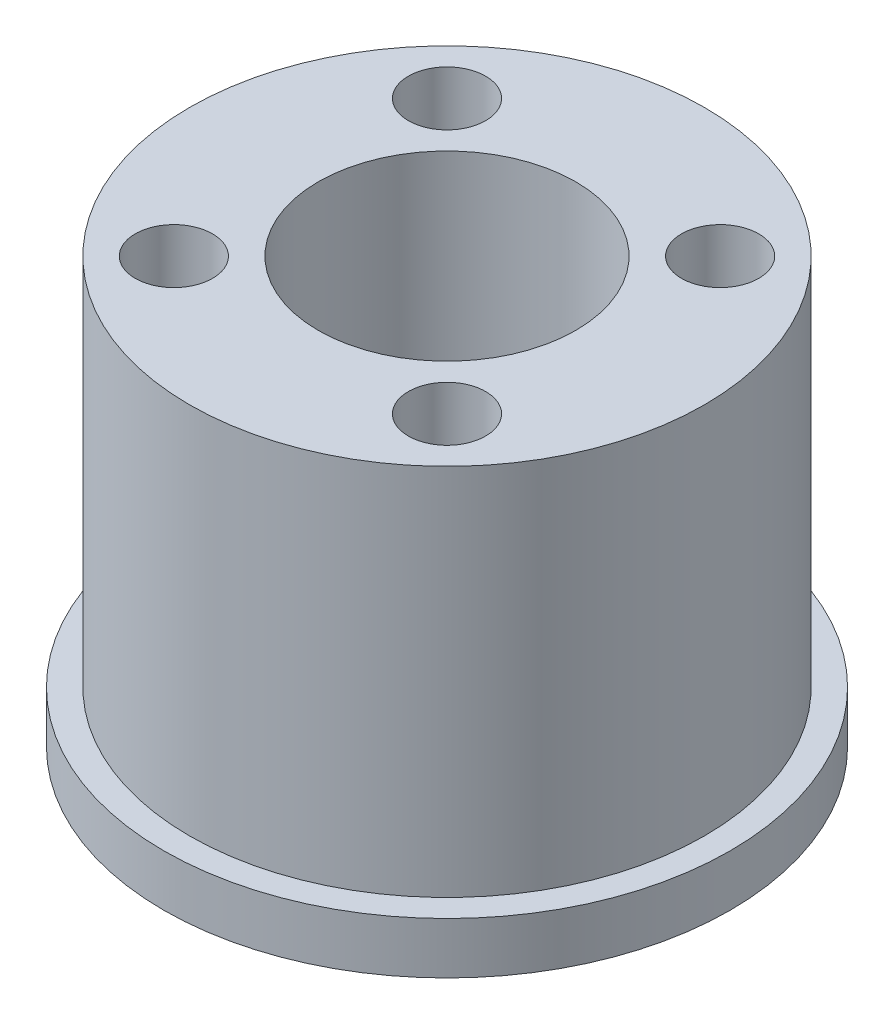
ISO-10303-21;
HEADER;
FILE_DESCRIPTION(('STEP AP214'),'2;1');
FILE_NAME('part.step','',(''),(''),'','','');
FILE_SCHEMA(('AUTOMOTIVE_DESIGN { 1 0 10303 214 1 1 1 1 }'));
ENDSEC;
DATA;
#1=APPLICATION_CONTEXT('core data for automotive mechanical design processes');
#2=APPLICATION_PROTOCOL_DEFINITION('international standard','automotive_design',2000,#1);
#3=PRODUCT_CONTEXT('',#1,'mechanical');
#4=PRODUCT('Part','Part','',(#3));
#5=PRODUCT_RELATED_PRODUCT_CATEGORY('part','',(#4));
#6=PRODUCT_DEFINITION_FORMATION('','',#4);
#7=PRODUCT_DEFINITION_CONTEXT('part definition',#1,'design');
#8=PRODUCT_DEFINITION('design','',#6,#7);
#9=PRODUCT_DEFINITION_SHAPE('','',#8);
#10=(LENGTH_UNIT() NAMED_UNIT(*) SI_UNIT(.MILLI.,.METRE.));
#11=(NAMED_UNIT(*) PLANE_ANGLE_UNIT() SI_UNIT($,.RADIAN.));
#12=(NAMED_UNIT(*) SI_UNIT($,.STERADIAN.) SOLID_ANGLE_UNIT());
#13=UNCERTAINTY_MEASURE_WITH_UNIT(LENGTH_MEASURE(1.E-05),#10,'distance_accuracy_value','');
#14=(GEOMETRIC_REPRESENTATION_CONTEXT(3) GLOBAL_UNCERTAINTY_ASSIGNED_CONTEXT((#13)) GLOBAL_UNIT_ASSIGNED_CONTEXT((#10,
#11,#12)) REPRESENTATION_CONTEXT('',''));
#15=CARTESIAN_POINT('',(0.,0.,0.));
#16=DIRECTION('',(0.,0.,1.));
#17=DIRECTION('',(1.,0.,0.));
#18=AXIS2_PLACEMENT_3D('',#15,#16,#17);
#19=CARTESIAN_POINT('',(0.,2.,0.));
#20=DIRECTION('',(0.,-1.,0.));
#21=DIRECTION('',(0.,0.,-1.));
#22=AXIS2_PLACEMENT_3D('',#19,#20,#21);
#23=CYLINDRICAL_SURFACE('',#22,11.);
#24=CARTESIAN_POINT('',(0.,2.,0.));
#25=DIRECTION('',(0.,-1.,0.));
#26=DIRECTION('',(0.,0.,-1.));
#27=AXIS2_PLACEMENT_3D('',#24,#25,#26);
#28=CIRCLE('',#27,11.);
#29=CARTESIAN_POINT('',(0.,2.,-11.));
#30=VERTEX_POINT('',#29);
#31=EDGE_CURVE('E35',#30,#30,#28,.T.);
#32=ORIENTED_EDGE('',*,*,#31,.T.);
#33=EDGE_LOOP('',(#32));
#34=FACE_BOUND('',#33,.T.);
#35=CARTESIAN_POINT('',(0.,0.,0.));
#36=DIRECTION('',(0.,-1.,0.));
#37=DIRECTION('',(0.,0.,-1.));
#38=AXIS2_PLACEMENT_3D('',#35,#36,#37);
#39=CIRCLE('',#38,11.);
#40=CARTESIAN_POINT('',(0.,0.,-11.));
#41=VERTEX_POINT('',#40);
#42=EDGE_CURVE('E43',#41,#41,#39,.T.);
#43=ORIENTED_EDGE('',*,*,#42,.F.);
#44=EDGE_LOOP('',(#43));
#45=FACE_BOUND('',#44,.T.);
#46=ADVANCED_FACE('F32',(#34,#45),#23,.T.);
#47=CARTESIAN_POINT('',(11.,2.,0.));
#48=DIRECTION('',(0.,1.,0.));
#49=DIRECTION('',(0.,0.,1.));
#50=AXIS2_PLACEMENT_3D('',#47,#48,#49);
#51=PLANE('',#50);
#52=CARTESIAN_POINT('',(0.,2.,0.));
#53=DIRECTION('',(0.,1.,0.));
#54=DIRECTION('',(0.,0.,1.));
#55=AXIS2_PLACEMENT_3D('',#52,#53,#54);
#56=CIRCLE('',#55,10.);
#57=CARTESIAN_POINT('',(0.,2.,-10.));
#58=VERTEX_POINT('',#57);
#59=EDGE_CURVE('E10',#58,#58,#56,.T.);
#60=ORIENTED_EDGE('',*,*,#59,.F.);
#61=EDGE_LOOP('',(#60));
#62=FACE_BOUND('',#61,.T.);
#63=ORIENTED_EDGE('',*,*,#31,.F.);
#64=EDGE_LOOP('',(#63));
#65=FACE_BOUND('',#64,.T.);
#66=ADVANCED_FACE('F91',(#62,#65),#51,.T.);
#67=CARTESIAN_POINT('',(0.,0.,0.));
#68=DIRECTION('',(0.,-1.,0.));
#69=DIRECTION('',(0.,0.,-1.));
#70=AXIS2_PLACEMENT_3D('',#67,#68,#69);
#71=PLANE('',#70);
#72=CARTESIAN_POINT('',(0.,0.,0.));
#73=DIRECTION('',(0.,-1.,0.));
#74=DIRECTION('',(0.,0.,-1.));
#75=AXIS2_PLACEMENT_3D('',#72,#73,#74);
#76=CIRCLE('',#75,4.99999999999999);
#77=CARTESIAN_POINT('',(0.,0.,-4.99999999999999));
#78=VERTEX_POINT('',#77);
#79=EDGE_CURVE('E82',#78,#78,#76,.T.);
#80=ORIENTED_EDGE('',*,*,#79,.F.);
#81=EDGE_LOOP('',(#80));
#82=FACE_BOUND('',#81,.T.);
#83=ORIENTED_EDGE('',*,*,#42,.T.);
#84=EDGE_LOOP('',(#83));
#85=FACE_BOUND('',#84,.T.);
#86=ADVANCED_FACE('F88',(#82,#85),#71,.T.);
#87=CARTESIAN_POINT('',(0.,16.5,0.));
#88=DIRECTION('',(0.,-1.,0.));
#89=DIRECTION('',(0.,0.,-1.));
#90=AXIS2_PLACEMENT_3D('',#87,#88,#89);
#91=CYLINDRICAL_SURFACE('',#90,10.);
#92=CARTESIAN_POINT('',(0.,16.5,0.));
#93=DIRECTION('',(0.,1.,0.));
#94=DIRECTION('',(0.,0.,1.));
#95=AXIS2_PLACEMENT_3D('',#92,#93,#94);
#96=CIRCLE('',#95,10.);
#97=CARTESIAN_POINT('',(0.,16.5,-10.));
#98=VERTEX_POINT('',#97);
#99=EDGE_CURVE('E45',#98,#98,#96,.T.);
#100=CARTESIAN_POINT('',(0.,16.5,-10.));
#101=CARTESIAN_POINT('',(0.,16.3489583333333,-10.));
#102=CARTESIAN_POINT('',(0.,16.1979166666667,-10.));
#103=CARTESIAN_POINT('',(0.,15.8958333333333,-10.));
#104=CARTESIAN_POINT('',(0.,15.7447916666667,-10.));
#105=CARTESIAN_POINT('',(0.,15.4427083333333,-10.));
#106=CARTESIAN_POINT('',(0.,15.2916666666667,-10.));
#107=CARTESIAN_POINT('',(0.,14.9895833333333,-10.));
#108=CARTESIAN_POINT('',(0.,14.8385416666667,-10.));
#109=CARTESIAN_POINT('',(0.,14.5364583333333,-10.));
#110=CARTESIAN_POINT('',(0.,14.3854166666667,-10.));
#111=CARTESIAN_POINT('',(0.,14.0833333333333,-10.));
#112=CARTESIAN_POINT('',(0.,13.9322916666667,-10.));
#113=CARTESIAN_POINT('',(0.,13.6302083333333,-10.));
#114=CARTESIAN_POINT('',(0.,13.4791666666667,-10.));
#115=CARTESIAN_POINT('',(0.,13.1770833333333,-10.));
#116=CARTESIAN_POINT('',(0.,13.0260416666667,-10.));
#117=CARTESIAN_POINT('',(0.,12.7239583333333,-10.));
#118=CARTESIAN_POINT('',(0.,12.5729166666667,-10.));
#119=CARTESIAN_POINT('',(0.,12.2708333333333,-10.));
#120=CARTESIAN_POINT('',(0.,12.1197916666667,-10.));
#121=CARTESIAN_POINT('',(0.,11.8177083333333,-10.));
#122=CARTESIAN_POINT('',(0.,11.6666666666667,-10.));
#123=CARTESIAN_POINT('',(0.,11.3645833333333,-10.));
#124=CARTESIAN_POINT('',(0.,11.2135416666667,-10.));
#125=CARTESIAN_POINT('',(0.,10.9114583333333,-10.));
#126=CARTESIAN_POINT('',(0.,10.7604166666667,-10.));
#127=CARTESIAN_POINT('',(0.,10.4583333333333,-10.));
#128=CARTESIAN_POINT('',(0.,10.3072916666667,-10.));
#129=CARTESIAN_POINT('',(0.,10.0052083333333,-10.));
#130=CARTESIAN_POINT('',(0.,9.85416666666667,-10.));
#131=CARTESIAN_POINT('',(0.,9.55208333333333,-10.));
#132=CARTESIAN_POINT('',(0.,9.40104166666667,-10.));
#133=CARTESIAN_POINT('',(0.,9.09895833333333,-10.));
#134=CARTESIAN_POINT('',(0.,8.94791666666667,-10.));
#135=CARTESIAN_POINT('',(0.,8.64583333333333,-10.));
#136=CARTESIAN_POINT('',(0.,8.49479166666667,-10.));
#137=CARTESIAN_POINT('',(0.,8.19270833333333,-10.));
#138=CARTESIAN_POINT('',(0.,8.04166666666667,-10.));
#139=CARTESIAN_POINT('',(0.,7.73958333333333,-10.));
#140=CARTESIAN_POINT('',(0.,7.58854166666667,-10.));
#141=CARTESIAN_POINT('',(0.,7.28645833333333,-10.));
#142=CARTESIAN_POINT('',(0.,7.13541666666667,-10.));
#143=CARTESIAN_POINT('',(0.,6.83333333333333,-10.));
#144=CARTESIAN_POINT('',(0.,6.68229166666667,-10.));
#145=CARTESIAN_POINT('',(0.,6.38020833333333,-10.));
#146=CARTESIAN_POINT('',(0.,6.22916666666667,-10.));
#147=CARTESIAN_POINT('',(0.,5.92708333333333,-10.));
#148=CARTESIAN_POINT('',(0.,5.77604166666667,-10.));
#149=CARTESIAN_POINT('',(0.,5.47395833333333,-10.));
#150=CARTESIAN_POINT('',(0.,5.32291666666667,-10.));
#151=CARTESIAN_POINT('',(0.,5.02083333333333,-10.));
#152=CARTESIAN_POINT('',(0.,4.86979166666667,-10.));
#153=CARTESIAN_POINT('',(0.,4.56770833333333,-10.));
#154=CARTESIAN_POINT('',(0.,4.41666666666667,-10.));
#155=CARTESIAN_POINT('',(0.,4.11458333333333,-10.));
#156=CARTESIAN_POINT('',(0.,3.96354166666667,-10.));
#157=CARTESIAN_POINT('',(0.,3.66145833333333,-10.));
#158=CARTESIAN_POINT('',(0.,3.51041666666667,-10.));
#159=CARTESIAN_POINT('',(0.,3.20833333333333,-10.));
#160=CARTESIAN_POINT('',(0.,3.05729166666667,-10.));
#161=CARTESIAN_POINT('',(0.,2.75520833333333,-10.));
#162=CARTESIAN_POINT('',(0.,2.60416666666667,-10.));
#163=CARTESIAN_POINT('',(0.,2.30208333333333,-10.));
#164=CARTESIAN_POINT('',(0.,2.15104166666667,-10.));
#165=CARTESIAN_POINT('',(0.,2.,-10.));
#166=B_SPLINE_CURVE_WITH_KNOTS('',3,(#100,#101,#102,#103,#104,#105,#106,#107,#108,#109,#110,
#111,#112,#113,#114,#115,#116,#117,#118,#119,#120,#121,#122,#123,#124,#125,#126,#127,#128,#129,
#130,#131,#132,#133,#134,#135,#136,#137,#138,#139,#140,#141,#142,#143,#144,#145,#146,#147,#148,
#149,#150,#151,#152,#153,#154,#155,#156,#157,#158,#159,#160,#161,#162,#163,#164,#165),
.UNSPECIFIED.,.F.,.F.,(4,2,2,2,2,2,2,2,2,2,2,2,2,2,2,2,2,2,2,2,2,2,2,2,2,2,2,2,2,2,2,2,4),(0.,
0.453124999999999,0.906249999999997,1.359375,1.8125,2.265625,2.71875,3.171875,3.625,4.078125,
4.53125,4.984375,5.4375,5.890625,6.34375,6.796875,7.25,7.703125,8.15625,8.609375,9.0625,
9.515625,9.96875,10.421875,10.875,11.328125,11.78125,12.234375,12.6875,13.140625,13.59375,
14.046875,14.5),.UNSPECIFIED.);
#167=EDGE_CURVE('BSEAM90',#98,#58,#166,.T.);
#168=ORIENTED_EDGE('',*,*,#99,.F.);
#169=ORIENTED_EDGE('',*,*,#59,.T.);
#170=ORIENTED_EDGE('',*,*,#167,.T.);
#171=ORIENTED_EDGE('',*,*,#167,.F.);
#172=EDGE_LOOP('',(#168,#170,#169,#171));
#173=FACE_BOUND('',#172,.T.);
#174=ADVANCED_FACE('F90',(#173),#91,.T.);
#175=CARTESIAN_POINT('',(0.,16.5,0.));
#176=DIRECTION('',(0.,1.,0.));
#177=DIRECTION('',(0.,0.,1.));
#178=AXIS2_PLACEMENT_3D('',#175,#176,#177);
#179=PLANE('',#178);
#180=CARTESIAN_POINT('',(0.,16.5,0.));
#181=DIRECTION('',(0.,-1.,0.));
#182=DIRECTION('',(0.,0.,-1.));
#183=AXIS2_PLACEMENT_3D('',#180,#181,#182);
#184=CIRCLE('',#183,5.);
#185=CARTESIAN_POINT('',(0.,16.5,-5.));
#186=VERTEX_POINT('',#185);
#187=EDGE_CURVE('E79',#186,#186,#184,.T.);
#188=ORIENTED_EDGE('',*,*,#187,.T.);
#189=EDGE_LOOP('',(#188));
#190=FACE_BOUND('',#189,.T.);
#191=CARTESIAN_POINT('',(5.30330085889911,16.5,-5.30330085889911));
#192=DIRECTION('',(0.,1.,0.));
#193=DIRECTION('',(0.,0.,1.));
#194=AXIS2_PLACEMENT_3D('',#191,#192,#193);
#195=CIRCLE('',#194,1.49999999999999);
#196=CARTESIAN_POINT('',(5.30330085889911,16.5,-3.80330085889912));
#197=VERTEX_POINT('',#196);
#198=EDGE_CURVE('E76',#197,#197,#195,.T.);
#199=ORIENTED_EDGE('',*,*,#198,.F.);
#200=EDGE_LOOP('',(#199));
#201=FACE_BOUND('',#200,.T.);
#202=CARTESIAN_POINT('',(5.30330085889911,16.5,5.30330085889911));
#203=DIRECTION('',(0.,1.,0.));
#204=DIRECTION('',(0.,0.,1.));
#205=AXIS2_PLACEMENT_3D('',#202,#203,#204);
#206=CIRCLE('',#205,1.49999999999999);
#207=CARTESIAN_POINT('',(5.30330085889911,16.5,6.8033008588991));
#208=VERTEX_POINT('',#207);
#209=EDGE_CURVE('E70',#208,#208,#206,.T.);
#210=ORIENTED_EDGE('',*,*,#209,.F.);
#211=EDGE_LOOP('',(#210));
#212=FACE_BOUND('',#211,.T.);
#213=CARTESIAN_POINT('',(-5.30330085889911,16.5,5.30330085889911));
#214=DIRECTION('',(0.,1.,0.));
#215=DIRECTION('',(0.,0.,1.));
#216=AXIS2_PLACEMENT_3D('',#213,#214,#215);
#217=CIRCLE('',#216,1.49999999999999);
#218=CARTESIAN_POINT('',(-5.30330085889911,16.5,6.8033008588991));
#219=VERTEX_POINT('',#218);
#220=EDGE_CURVE('E64',#219,#219,#217,.T.);
#221=ORIENTED_EDGE('',*,*,#220,.F.);
#222=EDGE_LOOP('',(#221));
#223=FACE_BOUND('',#222,.T.);
#224=CARTESIAN_POINT('',(-5.30330085889911,16.5,-5.30330085889911));
#225=DIRECTION('',(0.,1.,0.));
#226=DIRECTION('',(0.,0.,1.));
#227=AXIS2_PLACEMENT_3D('',#224,#225,#226);
#228=CIRCLE('',#227,1.49999999999999);
#229=CARTESIAN_POINT('',(-5.30330085889911,16.5,-3.80330085889912));
#230=VERTEX_POINT('',#229);
#231=EDGE_CURVE('E55',#230,#230,#228,.T.);
#232=ORIENTED_EDGE('',*,*,#231,.F.);
#233=EDGE_LOOP('',(#232));
#234=FACE_BOUND('',#233,.T.);
#235=ORIENTED_EDGE('',*,*,#99,.T.);
#236=EDGE_LOOP('',(#235));
#237=FACE_BOUND('',#236,.T.);
#238=ADVANCED_FACE('F97',(#190,#201,#212,#223,#234,#237),#179,.T.);
#239=CARTESIAN_POINT('',(-5.30330085889911,10.5,-5.30330085889911));
#240=DIRECTION('',(0.,-1.,0.));
#241=DIRECTION('',(0.,0.,-1.));
#242=AXIS2_PLACEMENT_3D('',#239,#240,#241);
#243=PLANE('',#242);
#244=CARTESIAN_POINT('',(-5.30330085889911,10.5,-5.30330085889911));
#245=DIRECTION('',(0.,1.,0.));
#246=DIRECTION('',(0.,0.,1.));
#247=AXIS2_PLACEMENT_3D('',#244,#245,#246);
#248=CIRCLE('',#247,1.49999999999999);
#249=CARTESIAN_POINT('',(-5.30330085889911,10.5,-3.80330085889912));
#250=VERTEX_POINT('',#249);
#251=EDGE_CURVE('E51',#250,#250,#248,.T.);
#252=ORIENTED_EDGE('',*,*,#251,.T.);
#253=EDGE_LOOP('',(#252));
#254=FACE_BOUND('',#253,.T.);
#255=ADVANCED_FACE('F126',(#254),#243,.F.);
#256=CARTESIAN_POINT('',(-5.30330085889911,16.5,-5.30330085889911));
#257=DIRECTION('',(0.,1.,0.));
#258=DIRECTION('',(0.,0.,1.));
#259=AXIS2_PLACEMENT_3D('',#256,#257,#258);
#260=CYLINDRICAL_SURFACE('',#259,1.49999999999999);
#261=ORIENTED_EDGE('',*,*,#251,.F.);
#262=EDGE_LOOP('',(#261));
#263=FACE_BOUND('',#262,.T.);
#264=ORIENTED_EDGE('',*,*,#231,.T.);
#265=EDGE_LOOP('',(#264));
#266=FACE_BOUND('',#265,.T.);
#267=ADVANCED_FACE('F131',(#263,#266),#260,.F.);
#268=CARTESIAN_POINT('',(-5.30330085889911,10.5,5.30330085889911));
#269=DIRECTION('',(0.,-1.,0.));
#270=DIRECTION('',(0.,0.,-1.));
#271=AXIS2_PLACEMENT_3D('',#268,#269,#270);
#272=PLANE('',#271);
#273=CARTESIAN_POINT('',(-5.30330085889911,10.5,5.30330085889911));
#274=DIRECTION('',(0.,1.,0.));
#275=DIRECTION('',(0.,0.,1.));
#276=AXIS2_PLACEMENT_3D('',#273,#274,#275);
#277=CIRCLE('',#276,1.49999999999999);
#278=CARTESIAN_POINT('',(-5.30330085889911,10.5,6.80330085889909));
#279=VERTEX_POINT('',#278);
#280=EDGE_CURVE('E59',#279,#279,#277,.T.);
#281=ORIENTED_EDGE('',*,*,#280,.T.);
#282=EDGE_LOOP('',(#281));
#283=FACE_BOUND('',#282,.T.);
#284=ADVANCED_FACE('F140',(#283),#272,.F.);
#285=CARTESIAN_POINT('',(-5.30330085889911,16.5,5.30330085889911));
#286=DIRECTION('',(0.,1.,0.));
#287=DIRECTION('',(0.,0.,1.));
#288=AXIS2_PLACEMENT_3D('',#285,#286,#287);
#289=CYLINDRICAL_SURFACE('',#288,1.49999999999999);
#290=ORIENTED_EDGE('',*,*,#280,.F.);
#291=EDGE_LOOP('',(#290));
#292=FACE_BOUND('',#291,.T.);
#293=ORIENTED_EDGE('',*,*,#220,.T.);
#294=EDGE_LOOP('',(#293));
#295=FACE_BOUND('',#294,.T.);
#296=ADVANCED_FACE('F150',(#292,#295),#289,.F.);
#297=CARTESIAN_POINT('',(5.3033008588991,10.5,5.30330085889911));
#298=DIRECTION('',(0.,-1.,0.));
#299=DIRECTION('',(0.,0.,-1.));
#300=AXIS2_PLACEMENT_3D('',#297,#298,#299);
#301=PLANE('',#300);
#302=CARTESIAN_POINT('',(5.30330085889911,10.5,5.30330085889911));
#303=DIRECTION('',(0.,1.,0.));
#304=DIRECTION('',(0.,0.,1.));
#305=AXIS2_PLACEMENT_3D('',#302,#303,#304);
#306=CIRCLE('',#305,1.49999999999999);
#307=CARTESIAN_POINT('',(5.30330085889911,10.5,6.80330085889909));
#308=VERTEX_POINT('',#307);
#309=EDGE_CURVE('E67',#308,#308,#306,.T.);
#310=ORIENTED_EDGE('',*,*,#309,.T.);
#311=EDGE_LOOP('',(#310));
#312=FACE_BOUND('',#311,.T.);
#313=ADVANCED_FACE('F160',(#312),#301,.F.);
#314=CARTESIAN_POINT('',(5.30330085889911,16.5,5.30330085889911));
#315=DIRECTION('',(0.,1.,0.));
#316=DIRECTION('',(0.,0.,1.));
#317=AXIS2_PLACEMENT_3D('',#314,#315,#316);
#318=CYLINDRICAL_SURFACE('',#317,1.49999999999999);
#319=ORIENTED_EDGE('',*,*,#309,.F.);
#320=EDGE_LOOP('',(#319));
#321=FACE_BOUND('',#320,.T.);
#322=ORIENTED_EDGE('',*,*,#209,.T.);
#323=EDGE_LOOP('',(#322));
#324=FACE_BOUND('',#323,.T.);
#325=ADVANCED_FACE('F170',(#321,#324),#318,.F.);
#326=CARTESIAN_POINT('',(5.3033008588991,10.5,-5.30330085889911));
#327=DIRECTION('',(0.,-1.,0.));
#328=DIRECTION('',(0.,0.,-1.));
#329=AXIS2_PLACEMENT_3D('',#326,#327,#328);
#330=PLANE('',#329);
#331=CARTESIAN_POINT('',(5.30330085889911,10.5,-5.30330085889911));
#332=DIRECTION('',(0.,1.,0.));
#333=DIRECTION('',(0.,0.,1.));
#334=AXIS2_PLACEMENT_3D('',#331,#332,#333);
#335=CIRCLE('',#334,1.49999999999999);
#336=CARTESIAN_POINT('',(5.30330085889911,10.5,-3.80330085889912));
#337=VERTEX_POINT('',#336);
#338=EDGE_CURVE('E73',#337,#337,#335,.T.);
#339=ORIENTED_EDGE('',*,*,#338,.T.);
#340=EDGE_LOOP('',(#339));
#341=FACE_BOUND('',#340,.T.);
#342=ADVANCED_FACE('F180',(#341),#330,.F.);
#343=CARTESIAN_POINT('',(5.30330085889911,16.5,-5.30330085889911));
#344=DIRECTION('',(0.,1.,0.));
#345=DIRECTION('',(0.,0.,1.));
#346=AXIS2_PLACEMENT_3D('',#343,#344,#345);
#347=CYLINDRICAL_SURFACE('',#346,1.49999999999999);
#348=ORIENTED_EDGE('',*,*,#338,.F.);
#349=EDGE_LOOP('',(#348));
#350=FACE_BOUND('',#349,.T.);
#351=ORIENTED_EDGE('',*,*,#198,.T.);
#352=EDGE_LOOP('',(#351));
#353=FACE_BOUND('',#352,.T.);
#354=ADVANCED_FACE('F190',(#350,#353),#347,.F.);
#355=CARTESIAN_POINT('',(0.,0.,0.));
#356=DIRECTION('',(0.,-1.,0.));
#357=DIRECTION('',(0.,0.,-1.));
#358=AXIS2_PLACEMENT_3D('',#355,#356,#357);
#359=CYLINDRICAL_SURFACE('',#358,4.99999999999999);
#360=ORIENTED_EDGE('',*,*,#187,.F.);
#361=EDGE_LOOP('',(#360));
#362=FACE_BOUND('',#361,.T.);
#363=ORIENTED_EDGE('',*,*,#79,.T.);
#364=EDGE_LOOP('',(#363));
#365=FACE_BOUND('',#364,.T.);
#366=ADVANCED_FACE('F86',(#362,#365),#359,.F.);
#367=CLOSED_SHELL('',(#46,#66,#86,#174,#238,#255,#267,#284,#296,#313,#325,#342,#354,#366));
#368=MANIFOLD_SOLID_BREP('B2',#367);
#369=ADVANCED_BREP_SHAPE_REPRESENTATION('',(#18,#368),#14);
#370=SHAPE_DEFINITION_REPRESENTATION(#9,#369);
ENDSEC;
END-ISO-10303-21;
